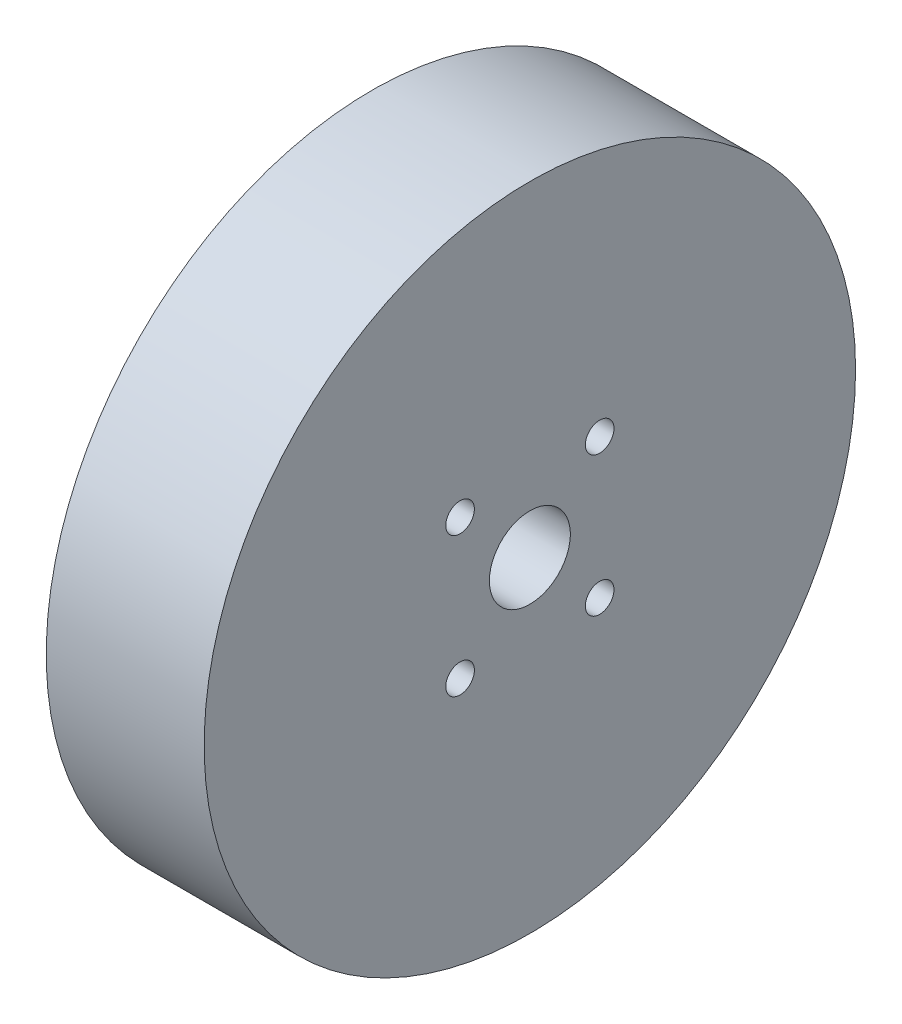
ISO-10303-21;
HEADER;
FILE_DESCRIPTION(('STEP AP214'),'2;1');
FILE_NAME('part.step','',(''),(''),'','','');
FILE_SCHEMA(('AUTOMOTIVE_DESIGN { 1 0 10303 214 1 1 1 1 }'));
ENDSEC;
DATA;
#1=APPLICATION_CONTEXT('core data for automotive mechanical design processes');
#2=APPLICATION_PROTOCOL_DEFINITION('international standard','automotive_design',2000,#1);
#3=PRODUCT_CONTEXT('',#1,'mechanical');
#4=PRODUCT('Part','Part','',(#3));
#5=PRODUCT_RELATED_PRODUCT_CATEGORY('part','',(#4));
#6=PRODUCT_DEFINITION_FORMATION('','',#4);
#7=PRODUCT_DEFINITION_CONTEXT('part definition',#1,'design');
#8=PRODUCT_DEFINITION('design','',#6,#7);
#9=PRODUCT_DEFINITION_SHAPE('','',#8);
#10=(LENGTH_UNIT() NAMED_UNIT(*) SI_UNIT(.MILLI.,.METRE.));
#11=(NAMED_UNIT(*) PLANE_ANGLE_UNIT() SI_UNIT($,.RADIAN.));
#12=(NAMED_UNIT(*) SI_UNIT($,.STERADIAN.) SOLID_ANGLE_UNIT());
#13=UNCERTAINTY_MEASURE_WITH_UNIT(LENGTH_MEASURE(1.E-05),#10,'distance_accuracy_value','');
#14=(GEOMETRIC_REPRESENTATION_CONTEXT(3) GLOBAL_UNCERTAINTY_ASSIGNED_CONTEXT((#13)) GLOBAL_UNIT_ASSIGNED_CONTEXT((#10,
#11,#12)) REPRESENTATION_CONTEXT('',''));
#15=CARTESIAN_POINT('',(0.,0.,0.));
#16=DIRECTION('',(0.,0.,1.));
#17=DIRECTION('',(1.,0.,0.));
#18=AXIS2_PLACEMENT_3D('',#15,#16,#17);
#19=CARTESIAN_POINT('',(16.,0.,0.));
#20=DIRECTION('',(-1.,0.,0.));
#21=DIRECTION('',(0.,0.,1.));
#22=AXIS2_PLACEMENT_3D('',#19,#20,#21);
#23=CYLINDRICAL_SURFACE('',#22,33.);
#24=CARTESIAN_POINT('',(16.,0.,0.));
#25=DIRECTION('',(1.,0.,0.));
#26=DIRECTION('',(0.,0.,-1.));
#27=AXIS2_PLACEMENT_3D('',#24,#25,#26);
#28=CIRCLE('',#27,33.);
#29=CARTESIAN_POINT('',(16.,0.,-33.));
#30=VERTEX_POINT('',#29);
#31=EDGE_CURVE('E10',#30,#30,#28,.T.);
#32=ORIENTED_EDGE('',*,*,#31,.F.);
#33=EDGE_LOOP('',(#32));
#34=FACE_BOUND('',#33,.T.);
#35=CARTESIAN_POINT('',(0.,0.,0.));
#36=DIRECTION('',(1.,0.,0.));
#37=DIRECTION('',(0.,0.,-1.));
#38=AXIS2_PLACEMENT_3D('',#35,#36,#37);
#39=CIRCLE('',#38,33.);
#40=CARTESIAN_POINT('',(0.,0.,-33.));
#41=VERTEX_POINT('',#40);
#42=EDGE_CURVE('E36',#41,#41,#39,.T.);
#43=ORIENTED_EDGE('',*,*,#42,.T.);
#44=EDGE_LOOP('',(#43));
#45=FACE_BOUND('',#44,.T.);
#46=ADVANCED_FACE('F33',(#34,#45),#23,.T.);
#47=CARTESIAN_POINT('',(16.,0.,0.));
#48=DIRECTION('',(1.,0.,0.));
#49=DIRECTION('',(0.,0.,-1.));
#50=AXIS2_PLACEMENT_3D('',#47,#48,#49);
#51=PLANE('',#50);
#52=CARTESIAN_POINT('',(16.,7.07106781186547,7.07106781186547));
#53=DIRECTION('',(-1.,0.,0.));
#54=DIRECTION('',(0.,0.,1.));
#55=AXIS2_PLACEMENT_3D('',#52,#53,#54);
#56=CIRCLE('',#55,1.45);
#57=CARTESIAN_POINT('',(16.,7.07106781186547,8.52106781186547));
#58=VERTEX_POINT('',#57);
#59=EDGE_CURVE('E54',#58,#58,#56,.T.);
#60=ORIENTED_EDGE('',*,*,#59,.T.);
#61=EDGE_LOOP('',(#60));
#62=FACE_BOUND('',#61,.T.);
#63=CARTESIAN_POINT('',(16.,-7.07106781186547,7.07106781186547));
#64=DIRECTION('',(-1.,0.,0.));
#65=DIRECTION('',(0.,0.,1.));
#66=AXIS2_PLACEMENT_3D('',#63,#64,#65);
#67=CIRCLE('',#66,1.45);
#68=CARTESIAN_POINT('',(16.,-7.07106781186547,8.52106781186547));
#69=VERTEX_POINT('',#68);
#70=EDGE_CURVE('E60',#69,#69,#67,.T.);
#71=ORIENTED_EDGE('',*,*,#70,.T.);
#72=EDGE_LOOP('',(#71));
#73=FACE_BOUND('',#72,.T.);
#74=CARTESIAN_POINT('',(16.,-7.07106781186547,-7.07106781186547));
#75=DIRECTION('',(-1.,0.,0.));
#76=DIRECTION('',(0.,0.,1.));
#77=AXIS2_PLACEMENT_3D('',#74,#75,#76);
#78=CIRCLE('',#77,1.45);
#79=CARTESIAN_POINT('',(16.,-7.07106781186547,-5.62106781186547));
#80=VERTEX_POINT('',#79);
#81=EDGE_CURVE('E66',#80,#80,#78,.T.);
#82=ORIENTED_EDGE('',*,*,#81,.T.);
#83=EDGE_LOOP('',(#82));
#84=FACE_BOUND('',#83,.T.);
#85=CARTESIAN_POINT('',(16.,7.07106781186547,-7.07106781186547));
#86=DIRECTION('',(-1.,0.,0.));
#87=DIRECTION('',(0.,0.,1.));
#88=AXIS2_PLACEMENT_3D('',#85,#86,#87);
#89=CIRCLE('',#88,1.45);
#90=CARTESIAN_POINT('',(16.,7.07106781186547,-5.62106781186547));
#91=VERTEX_POINT('',#90);
#92=EDGE_CURVE('E48',#91,#91,#89,.T.);
#93=ORIENTED_EDGE('',*,*,#92,.T.);
#94=EDGE_LOOP('',(#93));
#95=FACE_BOUND('',#94,.T.);
#96=CARTESIAN_POINT('',(16.,0.,0.));
#97=DIRECTION('',(-1.,0.,0.));
#98=DIRECTION('',(0.,0.,1.));
#99=AXIS2_PLACEMENT_3D('',#96,#97,#98);
#100=CIRCLE('',#99,4.1);
#101=CARTESIAN_POINT('',(16.,0.,4.1));
#102=VERTEX_POINT('',#101);
#103=EDGE_CURVE('E43',#102,#102,#100,.T.);
#104=ORIENTED_EDGE('',*,*,#103,.T.);
#105=EDGE_LOOP('',(#104));
#106=FACE_BOUND('',#105,.T.);
#107=ORIENTED_EDGE('',*,*,#31,.T.);
#108=EDGE_LOOP('',(#107));
#109=FACE_BOUND('',#108,.T.);
#110=ADVANCED_FACE('F75',(#62,#73,#84,#95,#106,#109),#51,.T.);
#111=CARTESIAN_POINT('',(0.,0.,0.));
#112=DIRECTION('',(1.,0.,0.));
#113=DIRECTION('',(0.,0.,-1.));
#114=AXIS2_PLACEMENT_3D('',#111,#112,#113);
#115=PLANE('',#114);
#116=CARTESIAN_POINT('',(0.,7.07106781186547,7.07106781186547));
#117=DIRECTION('',(-1.,0.,0.));
#118=DIRECTION('',(0.,0.,1.));
#119=AXIS2_PLACEMENT_3D('',#116,#117,#118);
#120=CIRCLE('',#119,1.45);
#121=CARTESIAN_POINT('',(0.,7.07106781186547,8.52106781186547));
#122=VERTEX_POINT('',#121);
#123=EDGE_CURVE('E51',#122,#122,#120,.T.);
#124=ORIENTED_EDGE('',*,*,#123,.F.);
#125=EDGE_LOOP('',(#124));
#126=FACE_BOUND('',#125,.T.);
#127=CARTESIAN_POINT('',(0.,-7.07106781186547,7.07106781186547));
#128=DIRECTION('',(-1.,0.,0.));
#129=DIRECTION('',(0.,0.,1.));
#130=AXIS2_PLACEMENT_3D('',#127,#128,#129);
#131=CIRCLE('',#130,1.45);
#132=CARTESIAN_POINT('',(0.,-7.07106781186547,8.52106781186547));
#133=VERTEX_POINT('',#132);
#134=EDGE_CURVE('E57',#133,#133,#131,.T.);
#135=ORIENTED_EDGE('',*,*,#134,.F.);
#136=EDGE_LOOP('',(#135));
#137=FACE_BOUND('',#136,.T.);
#138=CARTESIAN_POINT('',(0.,-7.07106781186547,-7.07106781186547));
#139=DIRECTION('',(-1.,0.,0.));
#140=DIRECTION('',(0.,0.,1.));
#141=AXIS2_PLACEMENT_3D('',#138,#139,#140);
#142=CIRCLE('',#141,1.45);
#143=CARTESIAN_POINT('',(0.,-7.07106781186547,-5.62106781186547));
#144=VERTEX_POINT('',#143);
#145=EDGE_CURVE('E63',#144,#144,#142,.T.);
#146=ORIENTED_EDGE('',*,*,#145,.F.);
#147=EDGE_LOOP('',(#146));
#148=FACE_BOUND('',#147,.T.);
#149=CARTESIAN_POINT('',(0.,7.07106781186547,-7.07106781186547));
#150=DIRECTION('',(-1.,0.,0.));
#151=DIRECTION('',(0.,0.,1.));
#152=AXIS2_PLACEMENT_3D('',#149,#150,#151);
#153=CIRCLE('',#152,1.45);
#154=CARTESIAN_POINT('',(0.,7.07106781186547,-5.62106781186547));
#155=VERTEX_POINT('',#154);
#156=EDGE_CURVE('E69',#155,#155,#153,.T.);
#157=ORIENTED_EDGE('',*,*,#156,.F.);
#158=EDGE_LOOP('',(#157));
#159=FACE_BOUND('',#158,.T.);
#160=CARTESIAN_POINT('',(0.,0.,0.));
#161=DIRECTION('',(-1.,0.,0.));
#162=DIRECTION('',(0.,0.,1.));
#163=AXIS2_PLACEMENT_3D('',#160,#161,#162);
#164=CIRCLE('',#163,4.1);
#165=CARTESIAN_POINT('',(0.,0.,4.1));
#166=VERTEX_POINT('',#165);
#167=EDGE_CURVE('E45',#166,#166,#164,.T.);
#168=ORIENTED_EDGE('',*,*,#167,.F.);
#169=EDGE_LOOP('',(#168));
#170=FACE_BOUND('',#169,.T.);
#171=ORIENTED_EDGE('',*,*,#42,.F.);
#172=EDGE_LOOP('',(#171));
#173=FACE_BOUND('',#172,.T.);
#174=ADVANCED_FACE('F86',(#126,#137,#148,#159,#170,#173),#115,.F.);
#175=CARTESIAN_POINT('',(16.,0.,0.));
#176=DIRECTION('',(-1.,0.,0.));
#177=DIRECTION('',(0.,0.,1.));
#178=AXIS2_PLACEMENT_3D('',#175,#176,#177);
#179=CYLINDRICAL_SURFACE('',#178,4.1);
#180=ORIENTED_EDGE('',*,*,#103,.F.);
#181=EDGE_LOOP('',(#180));
#182=FACE_BOUND('',#181,.T.);
#183=ORIENTED_EDGE('',*,*,#167,.T.);
#184=EDGE_LOOP('',(#183));
#185=FACE_BOUND('',#184,.T.);
#186=ADVANCED_FACE('F82',(#182,#185),#179,.F.);
#187=CARTESIAN_POINT('',(16.,7.07106781186547,-7.07106781186547));
#188=DIRECTION('',(-1.,0.,0.));
#189=DIRECTION('',(0.,0.,1.));
#190=AXIS2_PLACEMENT_3D('',#187,#188,#189);
#191=CYLINDRICAL_SURFACE('',#190,1.45);
#192=ORIENTED_EDGE('',*,*,#92,.F.);
#193=EDGE_LOOP('',(#192));
#194=FACE_BOUND('',#193,.T.);
#195=ORIENTED_EDGE('',*,*,#156,.T.);
#196=EDGE_LOOP('',(#195));
#197=FACE_BOUND('',#196,.T.);
#198=ADVANCED_FACE('F78',(#194,#197),#191,.F.);
#199=CARTESIAN_POINT('',(16.,-7.07106781186547,-7.07106781186547));
#200=DIRECTION('',(-1.,0.,0.));
#201=DIRECTION('',(0.,0.,1.));
#202=AXIS2_PLACEMENT_3D('',#199,#200,#201);
#203=CYLINDRICAL_SURFACE('',#202,1.45);
#204=ORIENTED_EDGE('',*,*,#81,.F.);
#205=EDGE_LOOP('',(#204));
#206=FACE_BOUND('',#205,.T.);
#207=ORIENTED_EDGE('',*,*,#145,.T.);
#208=EDGE_LOOP('',(#207));
#209=FACE_BOUND('',#208,.T.);
#210=ADVANCED_FACE('F81',(#206,#209),#203,.F.);
#211=CARTESIAN_POINT('',(16.,-7.07106781186547,7.07106781186547));
#212=DIRECTION('',(-1.,0.,0.));
#213=DIRECTION('',(0.,0.,1.));
#214=AXIS2_PLACEMENT_3D('',#211,#212,#213);
#215=CYLINDRICAL_SURFACE('',#214,1.45);
#216=ORIENTED_EDGE('',*,*,#70,.F.);
#217=EDGE_LOOP('',(#216));
#218=FACE_BOUND('',#217,.T.);
#219=ORIENTED_EDGE('',*,*,#134,.T.);
#220=EDGE_LOOP('',(#219));
#221=FACE_BOUND('',#220,.T.);
#222=ADVANCED_FACE('F111',(#218,#221),#215,.F.);
#223=CARTESIAN_POINT('',(16.,7.07106781186547,7.07106781186547));
#224=DIRECTION('',(-1.,0.,0.));
#225=DIRECTION('',(0.,0.,1.));
#226=AXIS2_PLACEMENT_3D('',#223,#224,#225);
#227=CYLINDRICAL_SURFACE('',#226,1.45);
#228=ORIENTED_EDGE('',*,*,#59,.F.);
#229=EDGE_LOOP('',(#228));
#230=FACE_BOUND('',#229,.T.);
#231=ORIENTED_EDGE('',*,*,#123,.T.);
#232=EDGE_LOOP('',(#231));
#233=FACE_BOUND('',#232,.T.);
#234=ADVANCED_FACE('F108',(#230,#233),#227,.F.);
#235=CLOSED_SHELL('',(#46,#110,#174,#186,#198,#210,#222,#234));
#236=MANIFOLD_SOLID_BREP('B2',#235);
#237=ADVANCED_BREP_SHAPE_REPRESENTATION('',(#18,#236),#14);
#238=SHAPE_DEFINITION_REPRESENTATION(#9,#237);
ENDSEC;
END-ISO-10303-21;
